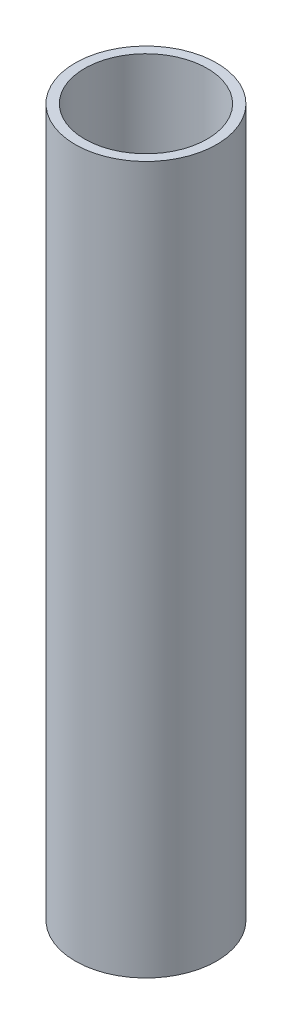
ISO-10303-21;
HEADER;
FILE_DESCRIPTION(('STEP AP214'),'2;1');
FILE_NAME('part.step','',(''),(''),'','','');
FILE_SCHEMA(('AUTOMOTIVE_DESIGN { 1 0 10303 214 1 1 1 1 }'));
ENDSEC;
DATA;
#1=APPLICATION_CONTEXT('core data for automotive mechanical design processes');
#2=APPLICATION_PROTOCOL_DEFINITION('international standard','automotive_design',2000,#1);
#3=PRODUCT_CONTEXT('',#1,'mechanical');
#4=PRODUCT('Part','Part','',(#3));
#5=PRODUCT_RELATED_PRODUCT_CATEGORY('part','',(#4));
#6=PRODUCT_DEFINITION_FORMATION('','',#4);
#7=PRODUCT_DEFINITION_CONTEXT('part definition',#1,'design');
#8=PRODUCT_DEFINITION('design','',#6,#7);
#9=PRODUCT_DEFINITION_SHAPE('','',#8);
#10=(LENGTH_UNIT() NAMED_UNIT(*) SI_UNIT(.MILLI.,.METRE.));
#11=(NAMED_UNIT(*) PLANE_ANGLE_UNIT() SI_UNIT($,.RADIAN.));
#12=(NAMED_UNIT(*) SI_UNIT($,.STERADIAN.) SOLID_ANGLE_UNIT());
#13=UNCERTAINTY_MEASURE_WITH_UNIT(LENGTH_MEASURE(1.E-05),#10,'distance_accuracy_value','');
#14=(GEOMETRIC_REPRESENTATION_CONTEXT(3) GLOBAL_UNCERTAINTY_ASSIGNED_CONTEXT((#13)) GLOBAL_UNIT_ASSIGNED_CONTEXT((#10,
#11,#12)) REPRESENTATION_CONTEXT('',''));
#15=CARTESIAN_POINT('',(0.,0.,0.));
#16=DIRECTION('',(0.,0.,1.));
#17=DIRECTION('',(1.,0.,0.));
#18=AXIS2_PLACEMENT_3D('',#15,#16,#17);
#19=CARTESIAN_POINT('',(0.,150.,0.));
#20=DIRECTION('',(0.,1.,0.));
#21=DIRECTION('',(0.,0.,1.));
#22=AXIS2_PLACEMENT_3D('',#19,#20,#21);
#23=PLANE('',#22);
#24=CARTESIAN_POINT('',(0.,150.,0.));
#25=DIRECTION('',(0.,1.,0.));
#26=DIRECTION('',(0.,0.,1.));
#27=AXIS2_PLACEMENT_3D('',#24,#25,#26);
#28=CIRCLE('',#27,15.);
#29=CARTESIAN_POINT('',(0.,150.,15.));
#30=VERTEX_POINT('',#29);
#31=EDGE_CURVE('E10',#30,#30,#28,.T.);
#32=ORIENTED_EDGE('',*,*,#31,.T.);
#33=EDGE_LOOP('',(#32));
#34=FACE_BOUND('',#33,.T.);
#35=CARTESIAN_POINT('',(0.,150.,0.));
#36=DIRECTION('',(0.,1.,0.));
#37=DIRECTION('',(0.,0.,1.));
#38=AXIS2_PLACEMENT_3D('',#35,#36,#37);
#39=CIRCLE('',#38,13.);
#40=CARTESIAN_POINT('',(0.,150.,13.));
#41=VERTEX_POINT('',#40);
#42=EDGE_CURVE('E46',#41,#41,#39,.T.);
#43=ORIENTED_EDGE('',*,*,#42,.F.);
#44=EDGE_LOOP('',(#43));
#45=FACE_BOUND('',#44,.T.);
#46=ADVANCED_FACE('F35',(#34,#45),#23,.T.);
#47=CARTESIAN_POINT('',(0.,0.,0.));
#48=DIRECTION('',(0.,1.,0.));
#49=DIRECTION('',(0.,0.,1.));
#50=AXIS2_PLACEMENT_3D('',#47,#48,#49);
#51=PLANE('',#50);
#52=CARTESIAN_POINT('',(0.,0.,0.));
#53=DIRECTION('',(0.,1.,0.));
#54=DIRECTION('',(0.,0.,1.));
#55=AXIS2_PLACEMENT_3D('',#52,#53,#54);
#56=CIRCLE('',#55,15.);
#57=CARTESIAN_POINT('',(0.,0.,15.));
#58=VERTEX_POINT('',#57);
#59=EDGE_CURVE('E39',#58,#58,#56,.T.);
#60=ORIENTED_EDGE('',*,*,#59,.F.);
#61=EDGE_LOOP('',(#60));
#62=FACE_BOUND('',#61,.T.);
#63=CARTESIAN_POINT('',(0.,0.,0.));
#64=DIRECTION('',(0.,1.,0.));
#65=DIRECTION('',(0.,0.,1.));
#66=AXIS2_PLACEMENT_3D('',#63,#64,#65);
#67=CIRCLE('',#66,13.);
#68=CARTESIAN_POINT('',(0.,0.,13.));
#69=VERTEX_POINT('',#68);
#70=EDGE_CURVE('E48',#69,#69,#67,.T.);
#71=ORIENTED_EDGE('',*,*,#70,.T.);
#72=EDGE_LOOP('',(#71));
#73=FACE_BOUND('',#72,.T.);
#74=ADVANCED_FACE('F58',(#62,#73),#51,.F.);
#75=CARTESIAN_POINT('',(0.,150.,0.));
#76=DIRECTION('',(0.,-1.,0.));
#77=DIRECTION('',(0.,0.,-1.));
#78=AXIS2_PLACEMENT_3D('',#75,#76,#77);
#79=CYLINDRICAL_SURFACE('',#78,15.);
#80=ORIENTED_EDGE('',*,*,#31,.F.);
#81=EDGE_LOOP('',(#80));
#82=FACE_BOUND('',#81,.T.);
#83=ORIENTED_EDGE('',*,*,#59,.T.);
#84=EDGE_LOOP('',(#83));
#85=FACE_BOUND('',#84,.T.);
#86=ADVANCED_FACE('F37',(#82,#85),#79,.T.);
#87=CARTESIAN_POINT('',(0.,150.,0.));
#88=DIRECTION('',(0.,-1.,0.));
#89=DIRECTION('',(0.,0.,-1.));
#90=AXIS2_PLACEMENT_3D('',#87,#88,#89);
#91=CYLINDRICAL_SURFACE('',#90,13.);
#92=ORIENTED_EDGE('',*,*,#42,.T.);
#93=EDGE_LOOP('',(#92));
#94=FACE_BOUND('',#93,.T.);
#95=ORIENTED_EDGE('',*,*,#70,.F.);
#96=EDGE_LOOP('',(#95));
#97=FACE_BOUND('',#96,.T.);
#98=ADVANCED_FACE('F54',(#94,#97),#91,.F.);
#99=CLOSED_SHELL('',(#46,#74,#86,#98));
#100=MANIFOLD_SOLID_BREP('B2',#99);
#101=ADVANCED_BREP_SHAPE_REPRESENTATION('',(#18,#100),#14);
#102=SHAPE_DEFINITION_REPRESENTATION(#9,#101);
ENDSEC;
END-ISO-10303-21;
